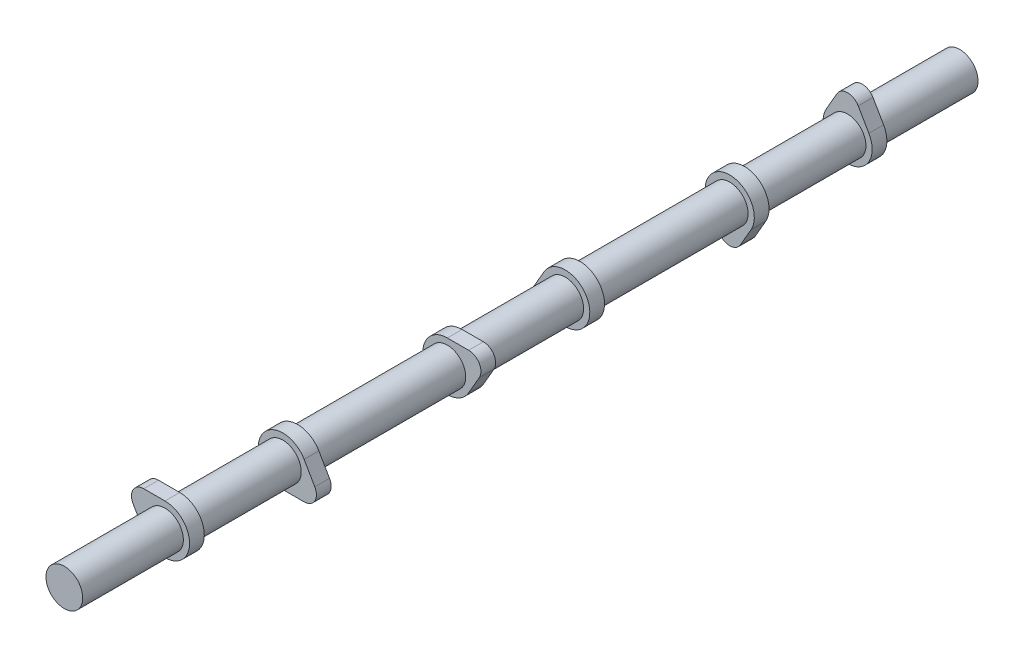
ISO-10303-21;
HEADER;
FILE_DESCRIPTION(('STEP AP214'),'2;1');
FILE_NAME('part.step','',(''),(''),'','','');
FILE_SCHEMA(('AUTOMOTIVE_DESIGN { 1 0 10303 214 1 1 1 1 }'));
ENDSEC;
DATA;
#1=APPLICATION_CONTEXT('core data for automotive mechanical design processes');
#2=APPLICATION_PROTOCOL_DEFINITION('international standard','automotive_design',2000,#1);
#3=PRODUCT_CONTEXT('',#1,'mechanical');
#4=PRODUCT('Part','Part','',(#3));
#5=PRODUCT_RELATED_PRODUCT_CATEGORY('part','',(#4));
#6=PRODUCT_DEFINITION_FORMATION('','',#4);
#7=PRODUCT_DEFINITION_CONTEXT('part definition',#1,'design');
#8=PRODUCT_DEFINITION('design','',#6,#7);
#9=PRODUCT_DEFINITION_SHAPE('','',#8);
#10=(LENGTH_UNIT() NAMED_UNIT(*) SI_UNIT(.MILLI.,.METRE.));
#11=(NAMED_UNIT(*) PLANE_ANGLE_UNIT() SI_UNIT($,.RADIAN.));
#12=(NAMED_UNIT(*) SI_UNIT($,.STERADIAN.) SOLID_ANGLE_UNIT());
#13=UNCERTAINTY_MEASURE_WITH_UNIT(LENGTH_MEASURE(1.E-05),#10,'distance_accuracy_value','');
#14=(GEOMETRIC_REPRESENTATION_CONTEXT(3) GLOBAL_UNCERTAINTY_ASSIGNED_CONTEXT((#13)) GLOBAL_UNIT_ASSIGNED_CONTEXT((#10,
#11,#12)) REPRESENTATION_CONTEXT('',''));
#15=CARTESIAN_POINT('',(0.,0.,0.));
#16=DIRECTION('',(0.,0.,1.));
#17=DIRECTION('',(1.,0.,0.));
#18=AXIS2_PLACEMENT_3D('',#15,#16,#17);
#19=CARTESIAN_POINT('',(-10.9985226280624,6.34999999999998,360.68));
#20=DIRECTION('',(0.,0.,-1.));
#21=DIRECTION('',(-0.499999999999998,-0.86602540378444,0.));
#22=AXIS2_PLACEMENT_3D('',#19,#20,#21);
#23=CYLINDRICAL_SURFACE('',#22,6.35);
#24=CARTESIAN_POINT('',(-10.9985226280624,6.34999999999998,353.06));
#25=DIRECTION('',(0.,0.,1.));
#26=DIRECTION('',(0.499999999999998,0.86602540378444,0.));
#27=AXIS2_PLACEMENT_3D('',#24,#25,#26);
#28=CIRCLE('',#27,6.35);
#29=CARTESIAN_POINT('',(-10.9985226280624,12.7,353.06));
#30=VERTEX_POINT('',#29);
#31=CARTESIAN_POINT('',(-16.4977839420936,3.17499999999997,353.06));
#32=VERTEX_POINT('',#31);
#33=EDGE_CURVE('E460',#30,#32,#28,.T.);
#34=ORIENTED_EDGE('',*,*,#33,.T.);
#35=DIRECTION('',(0.,0.,-1.));
#36=VECTOR('',#35,1.);
#37=CARTESIAN_POINT('',(-16.4977839420936,3.17499999999997,360.68));
#38=LINE('',#37,#36);
#39=CARTESIAN_POINT('',(-16.4977839420936,3.17499999999997,360.68));
#40=VERTEX_POINT('',#39);
#41=EDGE_CURVE('E490',#40,#32,#38,.T.);
#42=ORIENTED_EDGE('',*,*,#41,.F.);
#43=CARTESIAN_POINT('',(-10.9985226280624,6.34999999999998,360.68));
#44=DIRECTION('',(0.,0.,1.));
#45=DIRECTION('',(0.499999999999998,0.86602540378444,0.));
#46=AXIS2_PLACEMENT_3D('',#43,#44,#45);
#47=CIRCLE('',#46,6.35);
#48=CARTESIAN_POINT('',(-10.9985226280624,12.7,360.68));
#49=VERTEX_POINT('',#48);
#50=EDGE_CURVE('E461',#49,#40,#47,.T.);
#51=ORIENTED_EDGE('',*,*,#50,.F.);
#52=DIRECTION('',(0.,0.,-1.));
#53=VECTOR('',#52,1.);
#54=CARTESIAN_POINT('',(-10.9985226280624,12.7,360.68));
#55=LINE('',#54,#53);
#56=EDGE_CURVE('E471',#49,#30,#55,.T.);
#57=ORIENTED_EDGE('',*,*,#56,.T.);
#58=EDGE_LOOP('',(#34,#42,#51,#57));
#59=FACE_BOUND('',#58,.T.);
#60=ADVANCED_FACE('F45',(#59),#23,.T.);
#61=CARTESIAN_POINT('',(-16.4977839420936,3.17499999999997,360.68));
#62=DIRECTION('',(0.866025403784437,0.500000000000002,0.));
#63=DIRECTION('',(-0.500000000000002,0.866025403784438,0.));
#64=AXIS2_PLACEMENT_3D('',#61,#62,#63);
#65=PLANE('',#64);
#66=DIRECTION('',(0.500000000000002,-0.866025403784438,0.));
#67=VECTOR('',#66,1.);
#68=CARTESIAN_POINT('',(-16.4977839420936,3.17499999999997,353.06));
#69=LINE('',#68,#67);
#70=CARTESIAN_POINT('',(-10.9985226280624,-6.35000000000002,353.06));
#71=VERTEX_POINT('',#70);
#72=EDGE_CURVE('E475',#32,#71,#69,.T.);
#73=ORIENTED_EDGE('',*,*,#72,.T.);
#74=DIRECTION('',(0.,0.,-1.));
#75=VECTOR('',#74,1.);
#76=CARTESIAN_POINT('',(-10.9985226280624,-6.35000000000002,360.68));
#77=LINE('',#76,#75);
#78=CARTESIAN_POINT('',(-10.9985226280624,-6.35000000000002,360.68));
#79=VERTEX_POINT('',#78);
#80=EDGE_CURVE('E487',#79,#71,#77,.T.);
#81=ORIENTED_EDGE('',*,*,#80,.F.);
#82=DIRECTION('',(0.500000000000002,-0.866025403784438,0.));
#83=VECTOR('',#82,1.);
#84=CARTESIAN_POINT('',(-16.4977839420936,3.17499999999997,360.68));
#85=LINE('',#84,#83);
#86=EDGE_CURVE('E95',#40,#79,#85,.T.);
#87=ORIENTED_EDGE('',*,*,#86,.F.);
#88=ORIENTED_EDGE('',*,*,#41,.T.);
#89=EDGE_LOOP('',(#73,#81,#87,#88));
#90=FACE_BOUND('',#89,.T.);
#91=ADVANCED_FACE('F511',(#90),#65,.F.);
#92=CARTESIAN_POINT('',(0.,0.,360.68));
#93=DIRECTION('',(0.,0.,-1.));
#94=DIRECTION('',(-0.499999999999998,-0.86602540378444,0.));
#95=AXIS2_PLACEMENT_3D('',#92,#93,#94);
#96=CYLINDRICAL_SURFACE('',#95,12.7);
#97=CARTESIAN_POINT('',(0.,0.,353.06));
#98=DIRECTION('',(0.,0.,1.));
#99=DIRECTION('',(0.499999999999998,0.86602540378444,0.));
#100=AXIS2_PLACEMENT_3D('',#97,#98,#99);
#101=CIRCLE('',#100,12.7);
#102=CARTESIAN_POINT('',(0.,12.7,353.06));
#103=VERTEX_POINT('',#102);
#104=EDGE_CURVE('E81',#71,#103,#101,.T.);
#105=ORIENTED_EDGE('',*,*,#104,.T.);
#106=DIRECTION('',(0.,0.,-1.));
#107=VECTOR('',#106,1.);
#108=CARTESIAN_POINT('',(0.,12.7,360.68));
#109=LINE('',#108,#107);
#110=CARTESIAN_POINT('',(0.,12.7,360.68));
#111=VERTEX_POINT('',#110);
#112=EDGE_CURVE('E484',#111,#103,#109,.T.);
#113=ORIENTED_EDGE('',*,*,#112,.F.);
#114=CARTESIAN_POINT('',(0.,0.,360.68));
#115=DIRECTION('',(0.,0.,1.));
#116=DIRECTION('',(0.499999999999998,0.86602540378444,0.));
#117=AXIS2_PLACEMENT_3D('',#114,#115,#116);
#118=CIRCLE('',#117,12.7);
#119=EDGE_CURVE('E466',#79,#111,#118,.T.);
#120=ORIENTED_EDGE('',*,*,#119,.F.);
#121=ORIENTED_EDGE('',*,*,#80,.T.);
#122=EDGE_LOOP('',(#105,#113,#120,#121));
#123=FACE_BOUND('',#122,.T.);
#124=ADVANCED_FACE('F510',(#123),#96,.T.);
#125=CARTESIAN_POINT('',(-10.9985226280624,12.7,360.68));
#126=DIRECTION('',(0.,-1.,0.));
#127=DIRECTION('',(1.,0.,0.));
#128=AXIS2_PLACEMENT_3D('',#125,#126,#127);
#129=PLANE('',#128);
#130=DIRECTION('',(-1.,0.,0.));
#131=VECTOR('',#130,1.);
#132=CARTESIAN_POINT('',(-10.9985226280624,12.7,353.06));
#133=LINE('',#132,#131);
#134=EDGE_CURVE('E87',#103,#30,#133,.T.);
#135=ORIENTED_EDGE('',*,*,#134,.T.);
#136=ORIENTED_EDGE('',*,*,#56,.F.);
#137=DIRECTION('',(-1.,0.,0.));
#138=VECTOR('',#137,1.);
#139=CARTESIAN_POINT('',(-10.9985226280624,12.7,360.68));
#140=LINE('',#139,#138);
#141=EDGE_CURVE('E63',#111,#49,#140,.T.);
#142=ORIENTED_EDGE('',*,*,#141,.F.);
#143=ORIENTED_EDGE('',*,*,#112,.T.);
#144=EDGE_LOOP('',(#135,#136,#142,#143));
#145=FACE_BOUND('',#144,.T.);
#146=ADVANCED_FACE('F508',(#145),#129,.F.);
#147=CARTESIAN_POINT('',(-10.9985226280624,6.34999999999998,360.68));
#148=DIRECTION('',(0.,0.,1.));
#149=DIRECTION('',(0.499999999999998,0.86602540378444,0.));
#150=AXIS2_PLACEMENT_3D('',#147,#148,#149);
#151=PLANE('',#150);
#152=CARTESIAN_POINT('',(0.,0.,360.68));
#153=DIRECTION('',(0.,0.,1.));
#154=DIRECTION('',(-0.499999999999992,-0.866025403784443,0.));
#155=AXIS2_PLACEMENT_3D('',#152,#153,#154);
#156=CIRCLE('',#155,9.5);
#157=CARTESIAN_POINT('',(-4.74999999999992,-8.22724133595221,360.68));
#158=VERTEX_POINT('',#157);
#159=EDGE_CURVE('E456',#158,#158,#156,.F.);
#160=ORIENTED_EDGE('',*,*,#159,.T.);
#161=EDGE_LOOP('',(#160));
#162=FACE_BOUND('',#161,.T.);
#163=ORIENTED_EDGE('',*,*,#50,.T.);
#164=ORIENTED_EDGE('',*,*,#86,.T.);
#165=ORIENTED_EDGE('',*,*,#119,.T.);
#166=ORIENTED_EDGE('',*,*,#141,.T.);
#167=EDGE_LOOP('',(#163,#164,#165,#166));
#168=FACE_BOUND('',#167,.T.);
#169=ADVANCED_FACE('F502',(#162,#168),#151,.T.);
#170=CARTESIAN_POINT('',(-10.9985226280624,6.34999999999998,353.06));
#171=DIRECTION('',(0.,0.,1.));
#172=DIRECTION('',(0.499999999999998,0.86602540378444,0.));
#173=AXIS2_PLACEMENT_3D('',#170,#171,#172);
#174=PLANE('',#173);
#175=CARTESIAN_POINT('',(0.,0.,353.06));
#176=DIRECTION('',(0.,0.,1.));
#177=DIRECTION('',(-0.499999999999992,-0.866025403784443,0.));
#178=AXIS2_PLACEMENT_3D('',#175,#176,#177);
#179=CIRCLE('',#178,9.5);
#180=CARTESIAN_POINT('',(-4.74999999999992,-8.22724133595221,353.06));
#181=VERTEX_POINT('',#180);
#182=EDGE_CURVE('E55',#181,#181,#179,.F.);
#183=ORIENTED_EDGE('',*,*,#182,.F.);
#184=EDGE_LOOP('',(#183));
#185=FACE_BOUND('',#184,.T.);
#186=ORIENTED_EDGE('',*,*,#33,.F.);
#187=ORIENTED_EDGE('',*,*,#134,.F.);
#188=ORIENTED_EDGE('',*,*,#104,.F.);
#189=ORIENTED_EDGE('',*,*,#72,.F.);
#190=EDGE_LOOP('',(#186,#187,#188,#189));
#191=FACE_BOUND('',#190,.T.);
#192=ADVANCED_FACE('F499',(#185,#191),#174,.F.);
#193=CARTESIAN_POINT('',(0.,0.,412.75));
#194=DIRECTION('',(0.,0.,-1.));
#195=DIRECTION('',(0.499999999999992,0.866025403784443,0.));
#196=AXIS2_PLACEMENT_3D('',#193,#194,#195);
#197=CYLINDRICAL_SURFACE('',#196,9.5);
#198=CARTESIAN_POINT('',(0.,0.,299.72));
#199=DIRECTION('',(0.,0.,1.));
#200=DIRECTION('',(-0.499999999999992,-0.866025403784443,0.));
#201=AXIS2_PLACEMENT_3D('',#198,#199,#200);
#202=CIRCLE('',#201,9.5);
#203=CARTESIAN_POINT('',(-4.74999999999992,-8.22724133595221,299.72));
#204=VERTEX_POINT('',#203);
#205=EDGE_CURVE('E48',#204,#204,#202,.T.);
#206=ORIENTED_EDGE('',*,*,#205,.T.);
#207=EDGE_LOOP('',(#206));
#208=FACE_BOUND('',#207,.T.);
#209=ORIENTED_EDGE('',*,*,#182,.T.);
#210=EDGE_LOOP('',(#209));
#211=FACE_BOUND('',#210,.T.);
#212=ADVANCED_FACE('F497',(#208,#211),#197,.T.);
#213=ORIENTED_EDGE('',*,*,#159,.F.);
#214=EDGE_LOOP('',(#213));
#215=FACE_BOUND('',#214,.T.);
#216=CARTESIAN_POINT('',(0.,0.,412.75));
#217=DIRECTION('',(0.,0.,1.));
#218=DIRECTION('',(-0.499999999999992,-0.866025403784443,0.));
#219=AXIS2_PLACEMENT_3D('',#216,#217,#218);
#220=CIRCLE('',#219,9.5);
#221=CARTESIAN_POINT('',(-4.74999999999992,-8.22724133595221,412.75));
#222=VERTEX_POINT('',#221);
#223=EDGE_CURVE('E452',#222,#222,#220,.T.);
#224=ORIENTED_EDGE('',*,*,#223,.F.);
#225=EDGE_LOOP('',(#224));
#226=FACE_BOUND('',#225,.T.);
#227=ADVANCED_FACE('F525',(#215,#226),#197,.T.);
#228=CARTESIAN_POINT('',(0.,0.,412.75));
#229=DIRECTION('',(0.,0.,1.));
#230=DIRECTION('',(-0.499999999999992,-0.866025403784443,0.));
#231=AXIS2_PLACEMENT_3D('',#228,#229,#230);
#232=PLANE('',#231);
#233=ORIENTED_EDGE('',*,*,#223,.T.);
#234=EDGE_LOOP('',(#233));
#235=FACE_BOUND('',#234,.T.);
#236=ADVANCED_FACE('F528',(#235),#232,.T.);
#237=CARTESIAN_POINT('',(10.9985226280624,-6.3499999999999,299.72));
#238=DIRECTION('',(0.,0.,-1.));
#239=DIRECTION('',(0.499999999999992,0.866025403784443,0.));
#240=AXIS2_PLACEMENT_3D('',#237,#238,#239);
#241=CYLINDRICAL_SURFACE('',#240,6.35);
#242=CARTESIAN_POINT('',(10.9985226280624,-6.3499999999999,292.1));
#243=DIRECTION('',(0.,0.,1.));
#244=DIRECTION('',(-0.499999999999992,-0.866025403784443,0.));
#245=AXIS2_PLACEMENT_3D('',#242,#243,#244);
#246=CIRCLE('',#245,6.35);
#247=CARTESIAN_POINT('',(10.9985226280625,-12.6999999999999,292.1));
#248=VERTEX_POINT('',#247);
#249=CARTESIAN_POINT('',(16.4977839420936,-3.17499999999985,292.1));
#250=VERTEX_POINT('',#249);
#251=EDGE_CURVE('E407',#248,#250,#246,.T.);
#252=ORIENTED_EDGE('',*,*,#251,.T.);
#253=DIRECTION('',(0.,0.,-1.));
#254=VECTOR('',#253,1.);
#255=CARTESIAN_POINT('',(16.4977839420936,-3.17499999999985,299.72));
#256=LINE('',#255,#254);
#257=CARTESIAN_POINT('',(16.4977839420936,-3.17499999999985,299.72));
#258=VERTEX_POINT('',#257);
#259=EDGE_CURVE('E448',#258,#250,#256,.T.);
#260=ORIENTED_EDGE('',*,*,#259,.F.);
#261=CARTESIAN_POINT('',(10.9985226280624,-6.3499999999999,299.72));
#262=DIRECTION('',(0.,0.,1.));
#263=DIRECTION('',(-0.499999999999992,-0.866025403784443,0.));
#264=AXIS2_PLACEMENT_3D('',#261,#262,#263);
#265=CIRCLE('',#264,6.35);
#266=CARTESIAN_POINT('',(10.9985226280625,-12.6999999999999,299.72));
#267=VERTEX_POINT('',#266);
#268=EDGE_CURVE('E411',#267,#258,#265,.T.);
#269=ORIENTED_EDGE('',*,*,#268,.F.);
#270=DIRECTION('',(0.,0.,-1.));
#271=VECTOR('',#270,1.);
#272=CARTESIAN_POINT('',(10.9985226280625,-12.6999999999999,299.72));
#273=LINE('',#272,#271);
#274=EDGE_CURVE('E425',#267,#248,#273,.T.);
#275=ORIENTED_EDGE('',*,*,#274,.T.);
#276=EDGE_LOOP('',(#252,#260,#269,#275));
#277=FACE_BOUND('',#276,.T.);
#278=ADVANCED_FACE('F533',(#277),#241,.T.);
#279=CARTESIAN_POINT('',(16.4977839420936,-3.17499999999985,299.72));
#280=DIRECTION('',(-0.866025403784434,-0.500000000000008,0.));
#281=DIRECTION('',(0.500000000000008,-0.866025403784434,0.));
#282=AXIS2_PLACEMENT_3D('',#279,#280,#281);
#283=PLANE('',#282);
#284=DIRECTION('',(-0.500000000000008,0.866025403784434,0.));
#285=VECTOR('',#284,1.);
#286=CARTESIAN_POINT('',(16.4977839420936,-3.17499999999985,292.1));
#287=LINE('',#286,#285);
#288=CARTESIAN_POINT('',(10.9985226280623,6.3500000000001,292.1));
#289=VERTEX_POINT('',#288);
#290=EDGE_CURVE('E429',#250,#289,#287,.T.);
#291=ORIENTED_EDGE('',*,*,#290,.T.);
#292=DIRECTION('',(0.,0.,-1.));
#293=VECTOR('',#292,1.);
#294=CARTESIAN_POINT('',(10.9985226280623,6.3500000000001,299.72));
#295=LINE('',#294,#293);
#296=CARTESIAN_POINT('',(10.9985226280623,6.3500000000001,299.72));
#297=VERTEX_POINT('',#296);
#298=EDGE_CURVE('E444',#297,#289,#295,.T.);
#299=ORIENTED_EDGE('',*,*,#298,.F.);
#300=DIRECTION('',(-0.500000000000008,0.866025403784434,0.));
#301=VECTOR('',#300,1.);
#302=CARTESIAN_POINT('',(16.4977839420936,-3.17499999999985,299.72));
#303=LINE('',#302,#301);
#304=EDGE_CURVE('E415',#258,#297,#303,.T.);
#305=ORIENTED_EDGE('',*,*,#304,.F.);
#306=ORIENTED_EDGE('',*,*,#259,.T.);
#307=EDGE_LOOP('',(#291,#299,#305,#306));
#308=FACE_BOUND('',#307,.T.);
#309=ADVANCED_FACE('F537',(#308),#283,.F.);
#310=CARTESIAN_POINT('',(0.,0.,299.72));
#311=DIRECTION('',(0.,0.,-1.));
#312=DIRECTION('',(0.499999999999992,0.866025403784443,0.));
#313=AXIS2_PLACEMENT_3D('',#310,#311,#312);
#314=CYLINDRICAL_SURFACE('',#313,12.7);
#315=CARTESIAN_POINT('',(0.,0.,292.1));
#316=DIRECTION('',(0.,0.,1.));
#317=DIRECTION('',(-0.499999999999992,-0.866025403784443,0.));
#318=AXIS2_PLACEMENT_3D('',#315,#316,#317);
#319=CIRCLE('',#318,12.7);
#320=CARTESIAN_POINT('',(1.10154940724527E-13,-12.7,292.1));
#321=VERTEX_POINT('',#320);
#322=EDGE_CURVE('E432',#289,#321,#319,.T.);
#323=ORIENTED_EDGE('',*,*,#322,.T.);
#324=DIRECTION('',(0.,0.,-1.));
#325=VECTOR('',#324,1.);
#326=CARTESIAN_POINT('',(1.10154940724527E-13,-12.7,299.72));
#327=LINE('',#326,#325);
#328=CARTESIAN_POINT('',(1.10154940724527E-13,-12.7,299.72));
#329=VERTEX_POINT('',#328);
#330=EDGE_CURVE('E440',#329,#321,#327,.T.);
#331=ORIENTED_EDGE('',*,*,#330,.F.);
#332=CARTESIAN_POINT('',(0.,0.,299.72));
#333=DIRECTION('',(0.,0.,1.));
#334=DIRECTION('',(-0.499999999999992,-0.866025403784443,0.));
#335=AXIS2_PLACEMENT_3D('',#332,#333,#334);
#336=CIRCLE('',#335,12.7);
#337=EDGE_CURVE('E419',#297,#329,#336,.T.);
#338=ORIENTED_EDGE('',*,*,#337,.F.);
#339=ORIENTED_EDGE('',*,*,#298,.T.);
#340=EDGE_LOOP('',(#323,#331,#338,#339));
#341=FACE_BOUND('',#340,.T.);
#342=ADVANCED_FACE('F541',(#341),#314,.T.);
#343=CARTESIAN_POINT('',(10.9985226280625,-12.6999999999999,299.72));
#344=DIRECTION('',(0.,1.,0.));
#345=DIRECTION('',(-1.,0.,0.));
#346=AXIS2_PLACEMENT_3D('',#343,#344,#345);
#347=PLANE('',#346);
#348=DIRECTION('',(1.,0.,0.));
#349=VECTOR('',#348,1.);
#350=CARTESIAN_POINT('',(10.9985226280625,-12.6999999999999,292.1));
#351=LINE('',#350,#349);
#352=EDGE_CURVE('E416',#321,#248,#351,.T.);
#353=ORIENTED_EDGE('',*,*,#352,.T.);
#354=ORIENTED_EDGE('',*,*,#274,.F.);
#355=DIRECTION('',(1.,0.,0.));
#356=VECTOR('',#355,1.);
#357=CARTESIAN_POINT('',(10.9985226280625,-12.6999999999999,299.72));
#358=LINE('',#357,#356);
#359=EDGE_CURVE('E422',#329,#267,#358,.T.);
#360=ORIENTED_EDGE('',*,*,#359,.F.);
#361=ORIENTED_EDGE('',*,*,#330,.T.);
#362=EDGE_LOOP('',(#353,#354,#360,#361));
#363=FACE_BOUND('',#362,.T.);
#364=ADVANCED_FACE('F545',(#363),#347,.F.);
#365=CARTESIAN_POINT('',(10.9985226280624,-6.3499999999999,299.72));
#366=DIRECTION('',(0.,0.,1.));
#367=DIRECTION('',(-0.499999999999992,-0.866025403784443,0.));
#368=AXIS2_PLACEMENT_3D('',#365,#366,#367);
#369=PLANE('',#368);
#370=ORIENTED_EDGE('',*,*,#205,.F.);
#371=EDGE_LOOP('',(#370));
#372=FACE_BOUND('',#371,.T.);
#373=ORIENTED_EDGE('',*,*,#268,.T.);
#374=ORIENTED_EDGE('',*,*,#304,.T.);
#375=ORIENTED_EDGE('',*,*,#337,.T.);
#376=ORIENTED_EDGE('',*,*,#359,.T.);
#377=EDGE_LOOP('',(#373,#374,#375,#376));
#378=FACE_BOUND('',#377,.T.);
#379=ADVANCED_FACE('F549',(#372,#378),#369,.T.);
#380=CARTESIAN_POINT('',(10.9985226280624,-6.3499999999999,292.1));
#381=DIRECTION('',(0.,0.,1.));
#382=DIRECTION('',(-0.499999999999992,-0.866025403784443,0.));
#383=AXIS2_PLACEMENT_3D('',#380,#381,#382);
#384=PLANE('',#383);
#385=CARTESIAN_POINT('',(0.,0.,292.1));
#386=DIRECTION('',(0.,0.,1.));
#387=DIRECTION('',(-0.499999999999992,-0.866025403784443,0.));
#388=AXIS2_PLACEMENT_3D('',#385,#386,#387);
#389=CIRCLE('',#388,9.5);
#390=CARTESIAN_POINT('',(-4.74999999999992,-8.22724133595221,292.1));
#391=VERTEX_POINT('',#390);
#392=EDGE_CURVE('E11',#391,#391,#389,.T.);
#393=ORIENTED_EDGE('',*,*,#392,.T.);
#394=EDGE_LOOP('',(#393));
#395=FACE_BOUND('',#394,.T.);
#396=ORIENTED_EDGE('',*,*,#251,.F.);
#397=ORIENTED_EDGE('',*,*,#352,.F.);
#398=ORIENTED_EDGE('',*,*,#322,.F.);
#399=ORIENTED_EDGE('',*,*,#290,.F.);
#400=EDGE_LOOP('',(#396,#397,#398,#399));
#401=FACE_BOUND('',#400,.T.);
#402=ADVANCED_FACE('F551',(#395,#401),#384,.F.);
#403=ORIENTED_EDGE('',*,*,#392,.F.);
#404=EDGE_LOOP('',(#403));
#405=FACE_BOUND('',#404,.T.);
#406=CARTESIAN_POINT('',(0.,0.,214.63));
#407=DIRECTION('',(0.,0.,1.));
#408=DIRECTION('',(-0.500000000000004,0.866025403784436,0.));
#409=AXIS2_PLACEMENT_3D('',#406,#407,#408);
#410=CIRCLE('',#409,9.5);
#411=CARTESIAN_POINT('',(-4.75000000000004,8.22724133595215,214.63));
#412=VERTEX_POINT('',#411);
#413=EDGE_CURVE('E353',#412,#412,#410,.F.);
#414=ORIENTED_EDGE('',*,*,#413,.F.);
#415=EDGE_LOOP('',(#414));
#416=FACE_BOUND('',#415,.T.);
#417=ADVANCED_FACE('F530',(#405,#416),#197,.T.);
#418=CARTESIAN_POINT('',(10.9985226280624,6.34999999999997,214.63));
#419=DIRECTION('',(0.,0.,-1.));
#420=DIRECTION('',(-0.499999999999998,0.86602540378444,0.));
#421=AXIS2_PLACEMENT_3D('',#418,#419,#420);
#422=CYLINDRICAL_SURFACE('',#421,6.35);
#423=CARTESIAN_POINT('',(10.9985226280624,6.34999999999997,207.01));
#424=DIRECTION('',(0.,0.,1.));
#425=DIRECTION('',(0.499999999999998,-0.86602540378444,0.));
#426=AXIS2_PLACEMENT_3D('',#423,#424,#425);
#427=CIRCLE('',#426,6.35);
#428=CARTESIAN_POINT('',(16.4977839420936,3.17499999999996,207.01));
#429=VERTEX_POINT('',#428);
#430=CARTESIAN_POINT('',(10.9985226280624,12.7,207.01));
#431=VERTEX_POINT('',#430);
#432=EDGE_CURVE('E357',#429,#431,#427,.T.);
#433=ORIENTED_EDGE('',*,*,#432,.T.);
#434=DIRECTION('',(0.,0.,-1.));
#435=VECTOR('',#434,1.);
#436=CARTESIAN_POINT('',(10.9985226280624,12.7,214.63));
#437=LINE('',#436,#435);
#438=CARTESIAN_POINT('',(10.9985226280624,12.7,214.63));
#439=VERTEX_POINT('',#438);
#440=EDGE_CURVE('E395',#439,#431,#437,.T.);
#441=ORIENTED_EDGE('',*,*,#440,.F.);
#442=CARTESIAN_POINT('',(10.9985226280624,6.34999999999997,214.63));
#443=DIRECTION('',(0.,0.,1.));
#444=DIRECTION('',(0.499999999999998,-0.86602540378444,0.));
#445=AXIS2_PLACEMENT_3D('',#442,#443,#444);
#446=CIRCLE('',#445,6.35);
#447=CARTESIAN_POINT('',(16.4977839420936,3.17499999999996,214.63));
#448=VERTEX_POINT('',#447);
#449=EDGE_CURVE('E358',#448,#439,#446,.T.);
#450=ORIENTED_EDGE('',*,*,#449,.F.);
#451=DIRECTION('',(0.,0.,-1.));
#452=VECTOR('',#451,1.);
#453=CARTESIAN_POINT('',(16.4977839420936,3.17499999999996,214.63));
#454=LINE('',#453,#452);
#455=EDGE_CURVE('E372',#448,#429,#454,.T.);
#456=ORIENTED_EDGE('',*,*,#455,.T.);
#457=EDGE_LOOP('',(#433,#441,#450,#456));
#458=FACE_BOUND('',#457,.T.);
#459=ADVANCED_FACE('F558',(#458),#422,.T.);
#460=CARTESIAN_POINT('',(10.9985226280624,12.7,214.63));
#461=DIRECTION('',(0.,-1.,0.));
#462=DIRECTION('',(1.,0.,0.));
#463=AXIS2_PLACEMENT_3D('',#460,#461,#462);
#464=PLANE('',#463);
#465=DIRECTION('',(-1.,0.,0.));
#466=VECTOR('',#465,1.);
#467=CARTESIAN_POINT('',(10.9985226280624,12.7,207.01));
#468=LINE('',#467,#466);
#469=CARTESIAN_POINT('',(0.,12.7,207.01));
#470=VERTEX_POINT('',#469);
#471=EDGE_CURVE('E376',#431,#470,#468,.T.);
#472=ORIENTED_EDGE('',*,*,#471,.T.);
#473=DIRECTION('',(0.,0.,-1.));
#474=VECTOR('',#473,1.);
#475=CARTESIAN_POINT('',(0.,12.7,214.63));
#476=LINE('',#475,#474);
#477=CARTESIAN_POINT('',(0.,12.7,214.63));
#478=VERTEX_POINT('',#477);
#479=EDGE_CURVE('E391',#478,#470,#476,.T.);
#480=ORIENTED_EDGE('',*,*,#479,.F.);
#481=DIRECTION('',(-1.,0.,0.));
#482=VECTOR('',#481,1.);
#483=CARTESIAN_POINT('',(10.9985226280624,12.7,214.63));
#484=LINE('',#483,#482);
#485=EDGE_CURVE('E362',#439,#478,#484,.T.);
#486=ORIENTED_EDGE('',*,*,#485,.F.);
#487=ORIENTED_EDGE('',*,*,#440,.T.);
#488=EDGE_LOOP('',(#472,#480,#486,#487));
#489=FACE_BOUND('',#488,.T.);
#490=ADVANCED_FACE('F561',(#489),#464,.F.);
#491=CARTESIAN_POINT('',(0.,0.,214.63));
#492=DIRECTION('',(0.,0.,-1.));
#493=DIRECTION('',(-0.499999999999998,0.86602540378444,0.));
#494=AXIS2_PLACEMENT_3D('',#491,#492,#493);
#495=CYLINDRICAL_SURFACE('',#494,12.7);
#496=CARTESIAN_POINT('',(0.,0.,207.01));
#497=DIRECTION('',(0.,0.,1.));
#498=DIRECTION('',(0.499999999999998,-0.86602540378444,0.));
#499=AXIS2_PLACEMENT_3D('',#496,#497,#498);
#500=CIRCLE('',#499,12.7);
#501=CARTESIAN_POINT('',(10.9985226280624,-6.35000000000003,207.01));
#502=VERTEX_POINT('',#501);
#503=EDGE_CURVE('E379',#470,#502,#500,.T.);
#504=ORIENTED_EDGE('',*,*,#503,.T.);
#505=DIRECTION('',(0.,0.,-1.));
#506=VECTOR('',#505,1.);
#507=CARTESIAN_POINT('',(10.9985226280624,-6.35000000000003,214.63));
#508=LINE('',#507,#506);
#509=CARTESIAN_POINT('',(10.9985226280624,-6.35000000000003,214.63));
#510=VERTEX_POINT('',#509);
#511=EDGE_CURVE('E387',#510,#502,#508,.T.);
#512=ORIENTED_EDGE('',*,*,#511,.F.);
#513=CARTESIAN_POINT('',(0.,0.,214.63));
#514=DIRECTION('',(0.,0.,1.));
#515=DIRECTION('',(0.499999999999998,-0.86602540378444,0.));
#516=AXIS2_PLACEMENT_3D('',#513,#514,#515);
#517=CIRCLE('',#516,12.7);
#518=EDGE_CURVE('E366',#478,#510,#517,.T.);
#519=ORIENTED_EDGE('',*,*,#518,.F.);
#520=ORIENTED_EDGE('',*,*,#479,.T.);
#521=EDGE_LOOP('',(#504,#512,#519,#520));
#522=FACE_BOUND('',#521,.T.);
#523=ADVANCED_FACE('F565',(#522),#495,.T.);
#524=CARTESIAN_POINT('',(16.4977839420936,3.17499999999996,214.63));
#525=DIRECTION('',(-0.866025403784437,0.500000000000002,0.));
#526=DIRECTION('',(-0.500000000000002,-0.866025403784437,0.));
#527=AXIS2_PLACEMENT_3D('',#524,#525,#526);
#528=PLANE('',#527);
#529=DIRECTION('',(0.500000000000002,0.866025403784437,0.));
#530=VECTOR('',#529,1.);
#531=CARTESIAN_POINT('',(16.4977839420936,3.17499999999996,207.01));
#532=LINE('',#531,#530);
#533=EDGE_CURVE('E363',#502,#429,#532,.T.);
#534=ORIENTED_EDGE('',*,*,#533,.T.);
#535=ORIENTED_EDGE('',*,*,#455,.F.);
#536=DIRECTION('',(0.500000000000002,0.866025403784437,0.));
#537=VECTOR('',#536,1.);
#538=CARTESIAN_POINT('',(16.4977839420936,3.17499999999996,214.63));
#539=LINE('',#538,#537);
#540=EDGE_CURVE('E369',#510,#448,#539,.T.);
#541=ORIENTED_EDGE('',*,*,#540,.F.);
#542=ORIENTED_EDGE('',*,*,#511,.T.);
#543=EDGE_LOOP('',(#534,#535,#541,#542));
#544=FACE_BOUND('',#543,.T.);
#545=ADVANCED_FACE('F569',(#544),#528,.F.);
#546=CARTESIAN_POINT('',(10.9985226280624,6.34999999999997,214.63));
#547=DIRECTION('',(0.,0.,1.));
#548=DIRECTION('',(0.499999999999998,-0.86602540378444,0.));
#549=AXIS2_PLACEMENT_3D('',#546,#547,#548);
#550=PLANE('',#549);
#551=ORIENTED_EDGE('',*,*,#413,.T.);
#552=EDGE_LOOP('',(#551));
#553=FACE_BOUND('',#552,.T.);
#554=ORIENTED_EDGE('',*,*,#449,.T.);
#555=ORIENTED_EDGE('',*,*,#485,.T.);
#556=ORIENTED_EDGE('',*,*,#518,.T.);
#557=ORIENTED_EDGE('',*,*,#540,.T.);
#558=EDGE_LOOP('',(#554,#555,#556,#557));
#559=FACE_BOUND('',#558,.T.);
#560=ADVANCED_FACE('F573',(#553,#559),#550,.T.);
#561=CARTESIAN_POINT('',(10.9985226280624,6.34999999999997,207.01));
#562=DIRECTION('',(0.,0.,1.));
#563=DIRECTION('',(0.499999999999998,-0.86602540378444,0.));
#564=AXIS2_PLACEMENT_3D('',#561,#562,#563);
#565=PLANE('',#564);
#566=CARTESIAN_POINT('',(0.,0.,207.01));
#567=DIRECTION('',(0.,0.,1.));
#568=DIRECTION('',(-0.500000000000004,0.866025403784436,0.));
#569=AXIS2_PLACEMENT_3D('',#566,#567,#568);
#570=CIRCLE('',#569,9.5);
#571=CARTESIAN_POINT('',(-4.75000000000004,8.22724133595215,207.01));
#572=VERTEX_POINT('',#571);
#573=EDGE_CURVE('E399',#572,#572,#570,.F.);
#574=ORIENTED_EDGE('',*,*,#573,.F.);
#575=EDGE_LOOP('',(#574));
#576=FACE_BOUND('',#575,.T.);
#577=ORIENTED_EDGE('',*,*,#432,.F.);
#578=ORIENTED_EDGE('',*,*,#533,.F.);
#579=ORIENTED_EDGE('',*,*,#503,.F.);
#580=ORIENTED_EDGE('',*,*,#471,.F.);
#581=EDGE_LOOP('',(#577,#578,#579,#580));
#582=FACE_BOUND('',#581,.T.);
#583=ADVANCED_FACE('F575',(#576,#582),#565,.F.);
#584=CARTESIAN_POINT('',(0.,0.,266.7));
#585=DIRECTION('',(0.,0.,-1.));
#586=DIRECTION('',(0.500000000000004,-0.866025403784436,0.));
#587=AXIS2_PLACEMENT_3D('',#584,#585,#586);
#588=CYLINDRICAL_SURFACE('',#587,9.5);
#589=CARTESIAN_POINT('',(0.,0.,153.67));
#590=DIRECTION('',(0.,0.,1.));
#591=DIRECTION('',(-0.500000000000004,0.866025403784436,0.));
#592=AXIS2_PLACEMENT_3D('',#589,#590,#591);
#593=CIRCLE('',#592,9.5);
#594=CARTESIAN_POINT('',(-4.75000000000004,8.22724133595215,153.67));
#595=VERTEX_POINT('',#594);
#596=EDGE_CURVE('E352',#595,#595,#593,.T.);
#597=ORIENTED_EDGE('',*,*,#596,.T.);
#598=EDGE_LOOP('',(#597));
#599=FACE_BOUND('',#598,.T.);
#600=ORIENTED_EDGE('',*,*,#573,.T.);
#601=EDGE_LOOP('',(#600));
#602=FACE_BOUND('',#601,.T.);
#603=ADVANCED_FACE('F578',(#599,#602),#588,.T.);
#604=CARTESIAN_POINT('',(-10.9985226280623,-6.35000000000005,153.67));
#605=DIRECTION('',(0.,0.,-1.));
#606=DIRECTION('',(0.500000000000004,-0.866025403784436,0.));
#607=AXIS2_PLACEMENT_3D('',#604,#605,#606);
#608=CYLINDRICAL_SURFACE('',#607,6.35);
#609=CARTESIAN_POINT('',(-10.9985226280623,-6.35000000000005,146.05));
#610=DIRECTION('',(0.,0.,1.));
#611=DIRECTION('',(-0.500000000000004,0.866025403784436,0.));
#612=AXIS2_PLACEMENT_3D('',#609,#610,#611);
#613=CIRCLE('',#612,6.35);
#614=CARTESIAN_POINT('',(-16.4977839420935,-3.17500000000007,146.05));
#615=VERTEX_POINT('',#614);
#616=CARTESIAN_POINT('',(-10.9985226280623,-12.7000000000001,146.05));
#617=VERTEX_POINT('',#616);
#618=EDGE_CURVE('E309',#615,#617,#613,.T.);
#619=ORIENTED_EDGE('',*,*,#618,.T.);
#620=DIRECTION('',(0.,0.,-1.));
#621=VECTOR('',#620,1.);
#622=CARTESIAN_POINT('',(-10.9985226280623,-12.7000000000001,153.67));
#623=LINE('',#622,#621);
#624=CARTESIAN_POINT('',(-10.9985226280623,-12.7000000000001,153.67));
#625=VERTEX_POINT('',#624);
#626=EDGE_CURVE('E348',#625,#617,#623,.T.);
#627=ORIENTED_EDGE('',*,*,#626,.F.);
#628=CARTESIAN_POINT('',(-10.9985226280623,-6.35000000000005,153.67));
#629=DIRECTION('',(0.,0.,1.));
#630=DIRECTION('',(-0.500000000000004,0.866025403784436,0.));
#631=AXIS2_PLACEMENT_3D('',#628,#629,#630);
#632=CIRCLE('',#631,6.35);
#633=CARTESIAN_POINT('',(-16.4977839420935,-3.17500000000007,153.67));
#634=VERTEX_POINT('',#633);
#635=EDGE_CURVE('E311',#634,#625,#632,.T.);
#636=ORIENTED_EDGE('',*,*,#635,.F.);
#637=DIRECTION('',(0.,0.,-1.));
#638=VECTOR('',#637,1.);
#639=CARTESIAN_POINT('',(-16.4977839420935,-3.17500000000007,153.67));
#640=LINE('',#639,#638);
#641=EDGE_CURVE('E325',#634,#615,#640,.T.);
#642=ORIENTED_EDGE('',*,*,#641,.T.);
#643=EDGE_LOOP('',(#619,#627,#636,#642));
#644=FACE_BOUND('',#643,.T.);
#645=ADVANCED_FACE('F589',(#644),#608,.T.);
#646=CARTESIAN_POINT('',(-10.9985226280623,-12.7000000000001,153.67));
#647=DIRECTION('',(0.,1.,0.));
#648=DIRECTION('',(-1.,0.,0.));
#649=AXIS2_PLACEMENT_3D('',#646,#647,#648);
#650=PLANE('',#649);
#651=DIRECTION('',(1.,0.,0.));
#652=VECTOR('',#651,1.);
#653=CARTESIAN_POINT('',(-10.9985226280623,-12.7000000000001,146.05));
#654=LINE('',#653,#652);
#655=CARTESIAN_POINT('',(0.,-12.7,146.05));
#656=VERTEX_POINT('',#655);
#657=EDGE_CURVE('E329',#617,#656,#654,.T.);
#658=ORIENTED_EDGE('',*,*,#657,.T.);
#659=DIRECTION('',(0.,0.,-1.));
#660=VECTOR('',#659,1.);
#661=CARTESIAN_POINT('',(0.,-12.7,153.67));
#662=LINE('',#661,#660);
#663=CARTESIAN_POINT('',(0.,-12.7,153.67));
#664=VERTEX_POINT('',#663);
#665=EDGE_CURVE('E344',#664,#656,#662,.T.);
#666=ORIENTED_EDGE('',*,*,#665,.F.);
#667=DIRECTION('',(1.,0.,0.));
#668=VECTOR('',#667,1.);
#669=CARTESIAN_POINT('',(-10.9985226280623,-12.7000000000001,153.67));
#670=LINE('',#669,#668);
#671=EDGE_CURVE('E315',#625,#664,#670,.T.);
#672=ORIENTED_EDGE('',*,*,#671,.F.);
#673=ORIENTED_EDGE('',*,*,#626,.T.);
#674=EDGE_LOOP('',(#658,#666,#672,#673));
#675=FACE_BOUND('',#674,.T.);
#676=ADVANCED_FACE('F592',(#675),#650,.F.);
#677=CARTESIAN_POINT('',(0.,0.,153.67));
#678=DIRECTION('',(0.,0.,-1.));
#679=DIRECTION('',(0.500000000000004,-0.866025403784436,0.));
#680=AXIS2_PLACEMENT_3D('',#677,#678,#679);
#681=CYLINDRICAL_SURFACE('',#680,12.7);
#682=CARTESIAN_POINT('',(0.,0.,146.05));
#683=DIRECTION('',(0.,0.,1.));
#684=DIRECTION('',(-0.500000000000004,0.866025403784436,0.));
#685=AXIS2_PLACEMENT_3D('',#682,#683,#684);
#686=CIRCLE('',#685,12.7);
#687=CARTESIAN_POINT('',(-10.9985226280624,6.34999999999996,146.05));
#688=VERTEX_POINT('',#687);
#689=EDGE_CURVE('E332',#656,#688,#686,.T.);
#690=ORIENTED_EDGE('',*,*,#689,.T.);
#691=DIRECTION('',(0.,0.,-1.));
#692=VECTOR('',#691,1.);
#693=CARTESIAN_POINT('',(-10.9985226280624,6.34999999999996,153.67));
#694=LINE('',#693,#692);
#695=CARTESIAN_POINT('',(-10.9985226280624,6.34999999999996,153.67));
#696=VERTEX_POINT('',#695);
#697=EDGE_CURVE('E340',#696,#688,#694,.T.);
#698=ORIENTED_EDGE('',*,*,#697,.F.);
#699=CARTESIAN_POINT('',(0.,0.,153.67));
#700=DIRECTION('',(0.,0.,1.));
#701=DIRECTION('',(-0.500000000000004,0.866025403784436,0.));
#702=AXIS2_PLACEMENT_3D('',#699,#700,#701);
#703=CIRCLE('',#702,12.7);
#704=EDGE_CURVE('E319',#664,#696,#703,.T.);
#705=ORIENTED_EDGE('',*,*,#704,.F.);
#706=ORIENTED_EDGE('',*,*,#665,.T.);
#707=EDGE_LOOP('',(#690,#698,#705,#706));
#708=FACE_BOUND('',#707,.T.);
#709=ADVANCED_FACE('F596',(#708),#681,.T.);
#710=CARTESIAN_POINT('',(-16.4977839420935,-3.17500000000007,153.67));
#711=DIRECTION('',(0.866025403784441,-0.499999999999996,0.));
#712=DIRECTION('',(0.499999999999996,0.866025403784441,0.));
#713=AXIS2_PLACEMENT_3D('',#710,#711,#712);
#714=PLANE('',#713);
#715=DIRECTION('',(-0.499999999999996,-0.866025403784441,0.));
#716=VECTOR('',#715,1.);
#717=CARTESIAN_POINT('',(-16.4977839420935,-3.17500000000007,146.05));
#718=LINE('',#717,#716);
#719=EDGE_CURVE('E316',#688,#615,#718,.T.);
#720=ORIENTED_EDGE('',*,*,#719,.T.);
#721=ORIENTED_EDGE('',*,*,#641,.F.);
#722=DIRECTION('',(-0.499999999999996,-0.866025403784441,0.));
#723=VECTOR('',#722,1.);
#724=CARTESIAN_POINT('',(-16.4977839420935,-3.17500000000007,153.67));
#725=LINE('',#724,#723);
#726=EDGE_CURVE('E322',#696,#634,#725,.T.);
#727=ORIENTED_EDGE('',*,*,#726,.F.);
#728=ORIENTED_EDGE('',*,*,#697,.T.);
#729=EDGE_LOOP('',(#720,#721,#727,#728));
#730=FACE_BOUND('',#729,.T.);
#731=ADVANCED_FACE('F600',(#730),#714,.F.);
#732=CARTESIAN_POINT('',(-10.9985226280623,-6.35000000000005,153.67));
#733=DIRECTION('',(0.,0.,1.));
#734=DIRECTION('',(-0.500000000000004,0.866025403784436,0.));
#735=AXIS2_PLACEMENT_3D('',#732,#733,#734);
#736=PLANE('',#735);
#737=ORIENTED_EDGE('',*,*,#596,.F.);
#738=EDGE_LOOP('',(#737));
#739=FACE_BOUND('',#738,.T.);
#740=ORIENTED_EDGE('',*,*,#635,.T.);
#741=ORIENTED_EDGE('',*,*,#671,.T.);
#742=ORIENTED_EDGE('',*,*,#704,.T.);
#743=ORIENTED_EDGE('',*,*,#726,.T.);
#744=EDGE_LOOP('',(#740,#741,#742,#743));
#745=FACE_BOUND('',#744,.T.);
#746=ADVANCED_FACE('F604',(#739,#745),#736,.T.);
#747=CARTESIAN_POINT('',(-10.9985226280623,-6.35000000000005,146.05));
#748=DIRECTION('',(0.,0.,1.));
#749=DIRECTION('',(-0.500000000000004,0.866025403784436,0.));
#750=AXIS2_PLACEMENT_3D('',#747,#748,#749);
#751=PLANE('',#750);
#752=CARTESIAN_POINT('',(0.,0.,146.05));
#753=DIRECTION('',(0.,0.,1.));
#754=DIRECTION('',(-0.500000000000004,0.866025403784436,0.));
#755=AXIS2_PLACEMENT_3D('',#752,#753,#754);
#756=CIRCLE('',#755,9.5);
#757=CARTESIAN_POINT('',(-4.75000000000004,8.22724133595215,146.05));
#758=VERTEX_POINT('',#757);
#759=EDGE_CURVE('E403',#758,#758,#756,.T.);
#760=ORIENTED_EDGE('',*,*,#759,.T.);
#761=EDGE_LOOP('',(#760));
#762=FACE_BOUND('',#761,.T.);
#763=ORIENTED_EDGE('',*,*,#618,.F.);
#764=ORIENTED_EDGE('',*,*,#719,.F.);
#765=ORIENTED_EDGE('',*,*,#689,.F.);
#766=ORIENTED_EDGE('',*,*,#657,.F.);
#767=EDGE_LOOP('',(#763,#764,#765,#766));
#768=FACE_BOUND('',#767,.T.);
#769=ADVANCED_FACE('F587',(#762,#768),#751,.F.);
#770=ORIENTED_EDGE('',*,*,#759,.F.);
#771=EDGE_LOOP('',(#770));
#772=FACE_BOUND('',#771,.T.);
#773=CARTESIAN_POINT('',(0.,0.,68.58));
#774=DIRECTION('',(0.,0.,1.));
#775=DIRECTION('',(1.,0.,0.));
#776=AXIS2_PLACEMENT_3D('',#773,#774,#775);
#777=CIRCLE('',#776,9.5);
#778=CARTESIAN_POINT('',(9.5,0.,68.58));
#779=VERTEX_POINT('',#778);
#780=EDGE_CURVE('E251',#779,#779,#777,.F.);
#781=ORIENTED_EDGE('',*,*,#780,.F.);
#782=EDGE_LOOP('',(#781));
#783=FACE_BOUND('',#782,.T.);
#784=ADVANCED_FACE('F583',(#772,#783),#588,.T.);
#785=CARTESIAN_POINT('',(0.,-12.7,68.58));
#786=DIRECTION('',(0.,0.,-1.));
#787=DIRECTION('',(1.,0.,0.));
#788=AXIS2_PLACEMENT_3D('',#785,#786,#787);
#789=CYLINDRICAL_SURFACE('',#788,6.35);
#790=CARTESIAN_POINT('',(0.,-12.7,60.96));
#791=DIRECTION('',(0.,0.,1.));
#792=DIRECTION('',(-1.,0.,0.));
#793=AXIS2_PLACEMENT_3D('',#790,#791,#792);
#794=CIRCLE('',#793,6.35);
#795=CARTESIAN_POINT('',(-5.4992613140313,-15.875,60.96));
#796=VERTEX_POINT('',#795);
#797=CARTESIAN_POINT('',(5.49926131403107,-15.875,60.96));
#798=VERTEX_POINT('',#797);
#799=EDGE_CURVE('E260',#796,#798,#794,.T.);
#800=ORIENTED_EDGE('',*,*,#799,.T.);
#801=DIRECTION('',(0.,0.,-1.));
#802=VECTOR('',#801,1.);
#803=CARTESIAN_POINT('',(5.49926131403107,-15.875,68.58));
#804=LINE('',#803,#802);
#805=CARTESIAN_POINT('',(5.49926131403107,-15.875,68.58));
#806=VERTEX_POINT('',#805);
#807=EDGE_CURVE('E298',#806,#798,#804,.T.);
#808=ORIENTED_EDGE('',*,*,#807,.F.);
#809=CARTESIAN_POINT('',(0.,-12.7,68.58));
#810=DIRECTION('',(0.,0.,1.));
#811=DIRECTION('',(-1.,0.,0.));
#812=AXIS2_PLACEMENT_3D('',#809,#810,#811);
#813=CIRCLE('',#812,6.35);
#814=CARTESIAN_POINT('',(-5.4992613140313,-15.875,68.58));
#815=VERTEX_POINT('',#814);
#816=EDGE_CURVE('E261',#815,#806,#813,.T.);
#817=ORIENTED_EDGE('',*,*,#816,.F.);
#818=DIRECTION('',(0.,0.,-1.));
#819=VECTOR('',#818,1.);
#820=CARTESIAN_POINT('',(-5.4992613140313,-15.875,68.58));
#821=LINE('',#820,#819);
#822=EDGE_CURVE('E275',#815,#796,#821,.T.);
#823=ORIENTED_EDGE('',*,*,#822,.T.);
#824=EDGE_LOOP('',(#800,#808,#817,#823));
#825=FACE_BOUND('',#824,.T.);
#826=ADVANCED_FACE('F586',(#825),#789,.T.);
#827=CARTESIAN_POINT('',(5.49926131403107,-15.875,68.58));
#828=DIRECTION('',(-0.866025403784435,0.500000000000006,0.));
#829=DIRECTION('',(-0.500000000000006,-0.866025403784435,0.));
#830=AXIS2_PLACEMENT_3D('',#827,#828,#829);
#831=PLANE('',#830);
#832=DIRECTION('',(0.500000000000006,0.866025403784435,0.));
#833=VECTOR('',#832,1.);
#834=CARTESIAN_POINT('',(5.49926131403107,-15.875,60.96));
#835=LINE('',#834,#833);
#836=CARTESIAN_POINT('',(10.9985226280623,-6.35000000000008,60.96));
#837=VERTEX_POINT('',#836);
#838=EDGE_CURVE('E279',#798,#837,#835,.T.);
#839=ORIENTED_EDGE('',*,*,#838,.T.);
#840=DIRECTION('',(0.,0.,-1.));
#841=VECTOR('',#840,1.);
#842=CARTESIAN_POINT('',(10.9985226280623,-6.35000000000008,68.58));
#843=LINE('',#842,#841);
#844=CARTESIAN_POINT('',(10.9985226280623,-6.35000000000008,68.58));
#845=VERTEX_POINT('',#844);
#846=EDGE_CURVE('E294',#845,#837,#843,.T.);
#847=ORIENTED_EDGE('',*,*,#846,.F.);
#848=DIRECTION('',(0.500000000000006,0.866025403784435,0.));
#849=VECTOR('',#848,1.);
#850=CARTESIAN_POINT('',(5.49926131403107,-15.875,68.58));
#851=LINE('',#850,#849);
#852=EDGE_CURVE('E265',#806,#845,#851,.T.);
#853=ORIENTED_EDGE('',*,*,#852,.F.);
#854=ORIENTED_EDGE('',*,*,#807,.T.);
#855=EDGE_LOOP('',(#839,#847,#853,#854));
#856=FACE_BOUND('',#855,.T.);
#857=ADVANCED_FACE('F614',(#856),#831,.F.);
#858=CARTESIAN_POINT('',(0.,0.,68.58));
#859=DIRECTION('',(0.,0.,-1.));
#860=DIRECTION('',(1.,0.,0.));
#861=AXIS2_PLACEMENT_3D('',#858,#859,#860);
#862=CYLINDRICAL_SURFACE('',#861,12.7);
#863=CARTESIAN_POINT('',(0.,0.,60.96));
#864=DIRECTION('',(0.,0.,1.));
#865=DIRECTION('',(-1.,0.,0.));
#866=AXIS2_PLACEMENT_3D('',#863,#864,#865);
#867=CIRCLE('',#866,12.7);
#868=CARTESIAN_POINT('',(-10.9985226280624,-6.34999999999992,60.96));
#869=VERTEX_POINT('',#868);
#870=EDGE_CURVE('E282',#837,#869,#867,.T.);
#871=ORIENTED_EDGE('',*,*,#870,.T.);
#872=DIRECTION('',(0.,0.,-1.));
#873=VECTOR('',#872,1.);
#874=CARTESIAN_POINT('',(-10.9985226280624,-6.34999999999992,68.58));
#875=LINE('',#874,#873);
#876=CARTESIAN_POINT('',(-10.9985226280624,-6.34999999999992,68.58));
#877=VERTEX_POINT('',#876);
#878=EDGE_CURVE('E290',#877,#869,#875,.T.);
#879=ORIENTED_EDGE('',*,*,#878,.F.);
#880=CARTESIAN_POINT('',(0.,0.,68.58));
#881=DIRECTION('',(0.,0.,1.));
#882=DIRECTION('',(-1.,0.,0.));
#883=AXIS2_PLACEMENT_3D('',#880,#881,#882);
#884=CIRCLE('',#883,12.7);
#885=EDGE_CURVE('E269',#845,#877,#884,.T.);
#886=ORIENTED_EDGE('',*,*,#885,.F.);
#887=ORIENTED_EDGE('',*,*,#846,.T.);
#888=EDGE_LOOP('',(#871,#879,#886,#887));
#889=FACE_BOUND('',#888,.T.);
#890=ADVANCED_FACE('F618',(#889),#862,.T.);
#891=CARTESIAN_POINT('',(-5.4992613140313,-15.875,68.58));
#892=DIRECTION('',(0.866025403784442,0.499999999999994,0.));
#893=DIRECTION('',(-0.499999999999994,0.866025403784442,0.));
#894=AXIS2_PLACEMENT_3D('',#891,#892,#893);
#895=PLANE('',#894);
#896=DIRECTION('',(0.499999999999994,-0.866025403784442,0.));
#897=VECTOR('',#896,1.);
#898=CARTESIAN_POINT('',(-5.4992613140313,-15.875,60.96));
#899=LINE('',#898,#897);
#900=EDGE_CURVE('E266',#869,#796,#899,.T.);
#901=ORIENTED_EDGE('',*,*,#900,.T.);
#902=ORIENTED_EDGE('',*,*,#822,.F.);
#903=DIRECTION('',(0.499999999999994,-0.866025403784442,0.));
#904=VECTOR('',#903,1.);
#905=CARTESIAN_POINT('',(-5.4992613140313,-15.875,68.58));
#906=LINE('',#905,#904);
#907=EDGE_CURVE('E272',#877,#815,#906,.T.);
#908=ORIENTED_EDGE('',*,*,#907,.F.);
#909=ORIENTED_EDGE('',*,*,#878,.T.);
#910=EDGE_LOOP('',(#901,#902,#908,#909));
#911=FACE_BOUND('',#910,.T.);
#912=ADVANCED_FACE('F622',(#911),#895,.F.);
#913=CARTESIAN_POINT('',(0.,-12.7,68.58));
#914=DIRECTION('',(0.,0.,1.));
#915=DIRECTION('',(-1.,0.,0.));
#916=AXIS2_PLACEMENT_3D('',#913,#914,#915);
#917=PLANE('',#916);
#918=ORIENTED_EDGE('',*,*,#780,.T.);
#919=EDGE_LOOP('',(#918));
#920=FACE_BOUND('',#919,.T.);
#921=ORIENTED_EDGE('',*,*,#816,.T.);
#922=ORIENTED_EDGE('',*,*,#852,.T.);
#923=ORIENTED_EDGE('',*,*,#885,.T.);
#924=ORIENTED_EDGE('',*,*,#907,.T.);
#925=EDGE_LOOP('',(#921,#922,#923,#924));
#926=FACE_BOUND('',#925,.T.);
#927=ADVANCED_FACE('F626',(#920,#926),#917,.T.);
#928=CARTESIAN_POINT('',(0.,-12.7,60.96));
#929=DIRECTION('',(0.,0.,1.));
#930=DIRECTION('',(-1.,0.,0.));
#931=AXIS2_PLACEMENT_3D('',#928,#929,#930);
#932=PLANE('',#931);
#933=CARTESIAN_POINT('',(0.,0.,60.96));
#934=DIRECTION('',(0.,0.,1.));
#935=DIRECTION('',(1.,0.,0.));
#936=AXIS2_PLACEMENT_3D('',#933,#934,#935);
#937=CIRCLE('',#936,9.5);
#938=CARTESIAN_POINT('',(9.5,0.,60.96));
#939=VERTEX_POINT('',#938);
#940=EDGE_CURVE('E302',#939,#939,#937,.F.);
#941=ORIENTED_EDGE('',*,*,#940,.F.);
#942=EDGE_LOOP('',(#941));
#943=FACE_BOUND('',#942,.T.);
#944=ORIENTED_EDGE('',*,*,#799,.F.);
#945=ORIENTED_EDGE('',*,*,#900,.F.);
#946=ORIENTED_EDGE('',*,*,#870,.F.);
#947=ORIENTED_EDGE('',*,*,#838,.F.);
#948=EDGE_LOOP('',(#944,#945,#946,#947));
#949=FACE_BOUND('',#948,.T.);
#950=ADVANCED_FACE('F628',(#943,#949),#932,.F.);
#951=CARTESIAN_POINT('',(0.,0.,120.65));
#952=DIRECTION('',(0.,0.,-1.));
#953=DIRECTION('',(-1.,0.,0.));
#954=AXIS2_PLACEMENT_3D('',#951,#952,#953);
#955=CYLINDRICAL_SURFACE('',#954,9.5);
#956=CARTESIAN_POINT('',(0.,0.,7.62));
#957=DIRECTION('',(0.,0.,1.));
#958=DIRECTION('',(1.,0.,0.));
#959=AXIS2_PLACEMENT_3D('',#956,#957,#958);
#960=CIRCLE('',#959,9.5);
#961=CARTESIAN_POINT('',(9.5,0.,7.62));
#962=VERTEX_POINT('',#961);
#963=EDGE_CURVE('E246',#962,#962,#960,.T.);
#964=ORIENTED_EDGE('',*,*,#963,.T.);
#965=EDGE_LOOP('',(#964));
#966=FACE_BOUND('',#965,.T.);
#967=ORIENTED_EDGE('',*,*,#940,.T.);
#968=EDGE_LOOP('',(#967));
#969=FACE_BOUND('',#968,.T.);
#970=ADVANCED_FACE('F631',(#966,#969),#955,.T.);
#971=CARTESIAN_POINT('',(0.,12.7,7.62));
#972=DIRECTION('',(0.,0.,-1.));
#973=DIRECTION('',(-1.,0.,0.));
#974=AXIS2_PLACEMENT_3D('',#971,#972,#973);
#975=CYLINDRICAL_SURFACE('',#974,6.35);
#976=CARTESIAN_POINT('',(0.,12.7,0.));
#977=DIRECTION('',(0.,0.,1.));
#978=DIRECTION('',(1.,0.,0.));
#979=AXIS2_PLACEMENT_3D('',#976,#977,#978);
#980=CIRCLE('',#979,6.35);
#981=CARTESIAN_POINT('',(5.49926131403119,15.875,0.));
#982=VERTEX_POINT('',#981);
#983=CARTESIAN_POINT('',(-5.49926131403118,15.875,0.));
#984=VERTEX_POINT('',#983);
#985=EDGE_CURVE('E244',#982,#984,#980,.T.);
#986=ORIENTED_EDGE('',*,*,#985,.T.);
#987=DIRECTION('',(0.,0.,-1.));
#988=VECTOR('',#987,1.);
#989=CARTESIAN_POINT('',(-5.49926131403118,15.875,7.62));
#990=LINE('',#989,#988);
#991=CARTESIAN_POINT('',(-5.49926131403118,15.875,7.62));
#992=VERTEX_POINT('',#991);
#993=EDGE_CURVE('E222',#992,#984,#990,.T.);
#994=ORIENTED_EDGE('',*,*,#993,.F.);
#995=CARTESIAN_POINT('',(0.,12.7,7.62));
#996=DIRECTION('',(0.,0.,1.));
#997=DIRECTION('',(1.,0.,0.));
#998=AXIS2_PLACEMENT_3D('',#995,#996,#997);
#999=CIRCLE('',#998,6.35);
#1000=CARTESIAN_POINT('',(5.49926131403119,15.875,7.62));
#1001=VERTEX_POINT('',#1000);
#1002=EDGE_CURVE('E230',#1001,#992,#999,.T.);
#1003=ORIENTED_EDGE('',*,*,#1002,.F.);
#1004=DIRECTION('',(0.,0.,-1.));
#1005=VECTOR('',#1004,1.);
#1006=CARTESIAN_POINT('',(5.49926131403119,15.875,7.62));
#1007=LINE('',#1006,#1005);
#1008=EDGE_CURVE('E677',#1001,#982,#1007,.T.);
#1009=ORIENTED_EDGE('',*,*,#1008,.T.);
#1010=EDGE_LOOP('',(#986,#994,#1003,#1009));
#1011=FACE_BOUND('',#1010,.T.);
#1012=ADVANCED_FACE('F242',(#1011),#975,.T.);
#1013=CARTESIAN_POINT('',(-5.49926131403118,15.875,7.62));
#1014=DIRECTION('',(0.866025403784438,-0.5,0.));
#1015=DIRECTION('',(0.5,0.866025403784439,0.));
#1016=AXIS2_PLACEMENT_3D('',#1013,#1014,#1015);
#1017=PLANE('',#1016);
#1018=DIRECTION('',(-0.5,-0.866025403784439,0.));
#1019=VECTOR('',#1018,1.);
#1020=CARTESIAN_POINT('',(-5.49926131403118,15.875,0.));
#1021=LINE('',#1020,#1019);
#1022=CARTESIAN_POINT('',(-10.9985226280624,6.35,0.));
#1023=VERTEX_POINT('',#1022);
#1024=EDGE_CURVE('E671',#984,#1023,#1021,.T.);
#1025=ORIENTED_EDGE('',*,*,#1024,.T.);
#1026=DIRECTION('',(0.,0.,-1.));
#1027=VECTOR('',#1026,1.);
#1028=CARTESIAN_POINT('',(-10.9985226280624,6.35,7.62));
#1029=LINE('',#1028,#1027);
#1030=CARTESIAN_POINT('',(-10.9985226280624,6.35,7.62));
#1031=VERTEX_POINT('',#1030);
#1032=EDGE_CURVE('E225',#1031,#1023,#1029,.T.);
#1033=ORIENTED_EDGE('',*,*,#1032,.F.);
#1034=DIRECTION('',(-0.5,-0.866025403784439,0.));
#1035=VECTOR('',#1034,1.);
#1036=CARTESIAN_POINT('',(-5.49926131403118,15.875,7.62));
#1037=LINE('',#1036,#1035);
#1038=EDGE_CURVE('E218',#992,#1031,#1037,.T.);
#1039=ORIENTED_EDGE('',*,*,#1038,.F.);
#1040=ORIENTED_EDGE('',*,*,#993,.T.);
#1041=EDGE_LOOP('',(#1025,#1033,#1039,#1040));
#1042=FACE_BOUND('',#1041,.T.);
#1043=ADVANCED_FACE('F220',(#1042),#1017,.F.);
#1044=CARTESIAN_POINT('',(0.,0.,7.62));
#1045=DIRECTION('',(0.,0.,-1.));
#1046=DIRECTION('',(-1.,0.,0.));
#1047=AXIS2_PLACEMENT_3D('',#1044,#1045,#1046);
#1048=CYLINDRICAL_SURFACE('',#1047,12.7);
#1049=CARTESIAN_POINT('',(0.,0.,0.));
#1050=DIRECTION('',(0.,0.,1.));
#1051=DIRECTION('',(1.,0.,0.));
#1052=AXIS2_PLACEMENT_3D('',#1049,#1050,#1051);
#1053=CIRCLE('',#1052,12.7);
#1054=CARTESIAN_POINT('',(10.9985226280624,6.34999999999999,0.));
#1055=VERTEX_POINT('',#1054);
#1056=EDGE_CURVE('E681',#1023,#1055,#1053,.T.);
#1057=ORIENTED_EDGE('',*,*,#1056,.T.);
#1058=DIRECTION('',(0.,0.,-1.));
#1059=VECTOR('',#1058,1.);
#1060=CARTESIAN_POINT('',(10.9985226280624,6.34999999999999,7.62));
#1061=LINE('',#1060,#1059);
#1062=CARTESIAN_POINT('',(10.9985226280624,6.34999999999999,7.62));
#1063=VERTEX_POINT('',#1062);
#1064=EDGE_CURVE('E253',#1063,#1055,#1061,.T.);
#1065=ORIENTED_EDGE('',*,*,#1064,.F.);
#1066=CARTESIAN_POINT('',(0.,0.,7.62));
#1067=DIRECTION('',(0.,0.,1.));
#1068=DIRECTION('',(1.,0.,0.));
#1069=AXIS2_PLACEMENT_3D('',#1066,#1067,#1068);
#1070=CIRCLE('',#1069,12.7);
#1071=EDGE_CURVE('E229',#1031,#1063,#1070,.T.);
#1072=ORIENTED_EDGE('',*,*,#1071,.F.);
#1073=ORIENTED_EDGE('',*,*,#1032,.T.);
#1074=EDGE_LOOP('',(#1057,#1065,#1072,#1073));
#1075=FACE_BOUND('',#1074,.T.);
#1076=ADVANCED_FACE('F646',(#1075),#1048,.T.);
#1077=CARTESIAN_POINT('',(5.49926131403119,15.875,7.62));
#1078=DIRECTION('',(-0.866025403784439,-0.5,0.));
#1079=DIRECTION('',(0.5,-0.866025403784439,0.));
#1080=AXIS2_PLACEMENT_3D('',#1077,#1078,#1079);
#1081=PLANE('',#1080);
#1082=DIRECTION('',(-0.5,0.866025403784439,0.));
#1083=VECTOR('',#1082,1.);
#1084=CARTESIAN_POINT('',(5.49926131403119,15.875,0.));
#1085=LINE('',#1084,#1083);
#1086=EDGE_CURVE('E240',#1055,#982,#1085,.T.);
#1087=ORIENTED_EDGE('',*,*,#1086,.T.);
#1088=ORIENTED_EDGE('',*,*,#1008,.F.);
#1089=DIRECTION('',(-0.5,0.866025403784439,0.));
#1090=VECTOR('',#1089,1.);
#1091=CARTESIAN_POINT('',(5.49926131403119,15.875,7.62));
#1092=LINE('',#1091,#1090);
#1093=EDGE_CURVE('E235',#1063,#1001,#1092,.T.);
#1094=ORIENTED_EDGE('',*,*,#1093,.F.);
#1095=ORIENTED_EDGE('',*,*,#1064,.T.);
#1096=EDGE_LOOP('',(#1087,#1088,#1094,#1095));
#1097=FACE_BOUND('',#1096,.T.);
#1098=ADVANCED_FACE('F649',(#1097),#1081,.F.);
#1099=CARTESIAN_POINT('',(0.,12.7,7.62));
#1100=DIRECTION('',(0.,0.,1.));
#1101=DIRECTION('',(1.,0.,0.));
#1102=AXIS2_PLACEMENT_3D('',#1099,#1100,#1101);
#1103=PLANE('',#1102);
#1104=ORIENTED_EDGE('',*,*,#963,.F.);
#1105=EDGE_LOOP('',(#1104));
#1106=FACE_BOUND('',#1105,.T.);
#1107=ORIENTED_EDGE('',*,*,#1002,.T.);
#1108=ORIENTED_EDGE('',*,*,#1038,.T.);
#1109=ORIENTED_EDGE('',*,*,#1071,.T.);
#1110=ORIENTED_EDGE('',*,*,#1093,.T.);
#1111=EDGE_LOOP('',(#1107,#1108,#1109,#1110));
#1112=FACE_BOUND('',#1111,.T.);
#1113=ADVANCED_FACE('F233',(#1106,#1112),#1103,.T.);
#1114=CARTESIAN_POINT('',(0.,12.7,0.));
#1115=DIRECTION('',(0.,0.,1.));
#1116=DIRECTION('',(1.,0.,0.));
#1117=AXIS2_PLACEMENT_3D('',#1114,#1115,#1116);
#1118=PLANE('',#1117);
#1119=CARTESIAN_POINT('',(0.,0.,0.));
#1120=DIRECTION('',(0.,0.,1.));
#1121=DIRECTION('',(1.,0.,0.));
#1122=AXIS2_PLACEMENT_3D('',#1119,#1120,#1121);
#1123=CIRCLE('',#1122,9.5);
#1124=CARTESIAN_POINT('',(9.5,0.,0.));
#1125=VERTEX_POINT('',#1124);
#1126=EDGE_CURVE('E306',#1125,#1125,#1123,.T.);
#1127=ORIENTED_EDGE('',*,*,#1126,.T.);
#1128=EDGE_LOOP('',(#1127));
#1129=FACE_BOUND('',#1128,.T.);
#1130=ORIENTED_EDGE('',*,*,#985,.F.);
#1131=ORIENTED_EDGE('',*,*,#1086,.F.);
#1132=ORIENTED_EDGE('',*,*,#1056,.F.);
#1133=ORIENTED_EDGE('',*,*,#1024,.F.);
#1134=EDGE_LOOP('',(#1130,#1131,#1132,#1133));
#1135=FACE_BOUND('',#1134,.T.);
#1136=ADVANCED_FACE('F640',(#1129,#1135),#1118,.F.);
#1137=ORIENTED_EDGE('',*,*,#1126,.F.);
#1138=EDGE_LOOP('',(#1137));
#1139=FACE_BOUND('',#1138,.T.);
#1140=CARTESIAN_POINT('',(0.,0.,-50.34));
#1141=DIRECTION('',(0.,0.,-1.));
#1142=DIRECTION('',(-1.,0.,0.));
#1143=AXIS2_PLACEMENT_3D('',#1140,#1141,#1142);
#1144=CIRCLE('',#1143,9.5);
#1145=CARTESIAN_POINT('',(-9.5,0.,-50.34));
#1146=VERTEX_POINT('',#1145);
#1147=EDGE_CURVE('E666',#1146,#1146,#1144,.T.);
#1148=ORIENTED_EDGE('',*,*,#1147,.F.);
#1149=EDGE_LOOP('',(#1148));
#1150=FACE_BOUND('',#1149,.T.);
#1151=ADVANCED_FACE('F636',(#1139,#1150),#955,.T.);
#1152=CARTESIAN_POINT('',(0.,0.,-50.34));
#1153=DIRECTION('',(0.,0.,-1.));
#1154=DIRECTION('',(-1.,0.,0.));
#1155=AXIS2_PLACEMENT_3D('',#1152,#1153,#1154);
#1156=PLANE('',#1155);
#1157=ORIENTED_EDGE('',*,*,#1147,.T.);
#1158=EDGE_LOOP('',(#1157));
#1159=FACE_BOUND('',#1158,.T.);
#1160=ADVANCED_FACE('F639',(#1159),#1156,.T.);
#1161=CLOSED_SHELL('',(#60,#91,#124,#146,#169,#192,#212,#227,#236,#278,#309,#342,#364,#379,#402,
#417,#459,#490,#523,#545,#560,#583,#603,#645,#676,#709,#731,#746,#769,#784,#826,#857,#890,#912,
#927,#950,#970,#1012,#1043,#1076,#1098,#1113,#1136,#1151,#1160));
#1162=MANIFOLD_SOLID_BREP('B2',#1161);
#1163=ADVANCED_BREP_SHAPE_REPRESENTATION('',(#18,#1162),#14);
#1164=SHAPE_DEFINITION_REPRESENTATION(#9,#1163);
ENDSEC;
END-ISO-10303-21;
